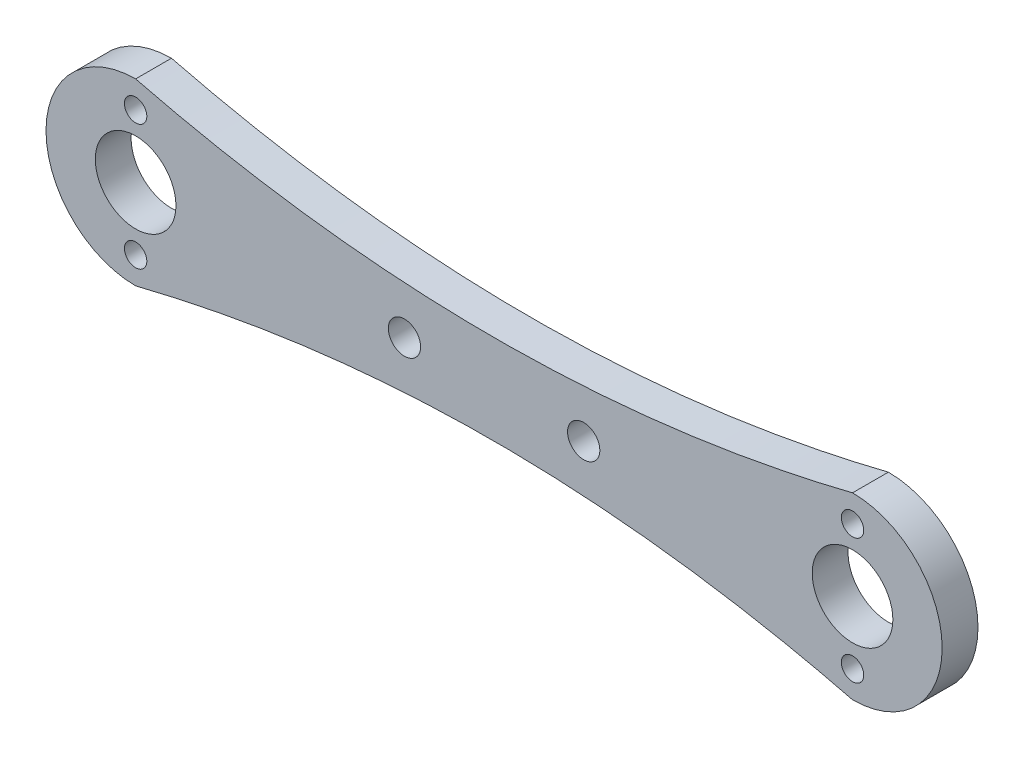
ISO-10303-21;
HEADER;
FILE_DESCRIPTION(('STEP AP214'),'2;1');
FILE_NAME('part.step','',(''),(''),'','','');
FILE_SCHEMA(('AUTOMOTIVE_DESIGN { 1 0 10303 214 1 1 1 1 }'));
ENDSEC;
DATA;
#1=APPLICATION_CONTEXT('core data for automotive mechanical design processes');
#2=APPLICATION_PROTOCOL_DEFINITION('international standard','automotive_design',2000,#1);
#3=PRODUCT_CONTEXT('',#1,'mechanical');
#4=PRODUCT('Part','Part','',(#3));
#5=PRODUCT_RELATED_PRODUCT_CATEGORY('part','',(#4));
#6=PRODUCT_DEFINITION_FORMATION('','',#4);
#7=PRODUCT_DEFINITION_CONTEXT('part definition',#1,'design');
#8=PRODUCT_DEFINITION('design','',#6,#7);
#9=PRODUCT_DEFINITION_SHAPE('','',#8);
#10=(LENGTH_UNIT() NAMED_UNIT(*) SI_UNIT(.MILLI.,.METRE.));
#11=(NAMED_UNIT(*) PLANE_ANGLE_UNIT() SI_UNIT($,.RADIAN.));
#12=(NAMED_UNIT(*) SI_UNIT($,.STERADIAN.) SOLID_ANGLE_UNIT());
#13=UNCERTAINTY_MEASURE_WITH_UNIT(LENGTH_MEASURE(1.E-05),#10,'distance_accuracy_value','');
#14=(GEOMETRIC_REPRESENTATION_CONTEXT(3) GLOBAL_UNCERTAINTY_ASSIGNED_CONTEXT((#13)) GLOBAL_UNIT_ASSIGNED_CONTEXT((#10,
#11,#12)) REPRESENTATION_CONTEXT('',''));
#15=CARTESIAN_POINT('',(0.,0.,0.));
#16=DIRECTION('',(0.,0.,1.));
#17=DIRECTION('',(1.,0.,0.));
#18=AXIS2_PLACEMENT_3D('',#15,#16,#17);
#19=CARTESIAN_POINT('',(0.,0.,4.));
#20=DIRECTION('',(0.,0.,-1.));
#21=DIRECTION('',(-1.,0.,0.));
#22=AXIS2_PLACEMENT_3D('',#19,#20,#21);
#23=CYLINDRICAL_SURFACE('',#22,10.0000002400058);
#24=CARTESIAN_POINT('',(0.,0.,0.));
#25=DIRECTION('',(0.,0.,1.));
#26=DIRECTION('',(1.,0.,0.));
#27=AXIS2_PLACEMENT_3D('',#24,#25,#26);
#28=CIRCLE('',#27,10.0000002400058);
#29=CARTESIAN_POINT('',(0.,10.0000002400058,0.));
#30=VERTEX_POINT('',#29);
#31=CARTESIAN_POINT('',(0.,-10.0000002400058,0.));
#32=VERTEX_POINT('',#31);
#33=EDGE_CURVE('E188',#30,#32,#28,.T.);
#34=ORIENTED_EDGE('',*,*,#33,.T.);
#35=DIRECTION('',(0.,0.,-1.));
#36=VECTOR('',#35,1.);
#37=CARTESIAN_POINT('',(0.,-10.0000002400058,4.));
#38=LINE('',#37,#36);
#39=CARTESIAN_POINT('',(0.,-10.0000002400058,4.));
#40=VERTEX_POINT('',#39);
#41=EDGE_CURVE('E11',#40,#32,#38,.T.);
#42=ORIENTED_EDGE('',*,*,#41,.F.);
#43=CARTESIAN_POINT('',(0.,0.,4.));
#44=DIRECTION('',(0.,0.,1.));
#45=DIRECTION('',(1.,0.,0.));
#46=AXIS2_PLACEMENT_3D('',#43,#44,#45);
#47=CIRCLE('',#46,10.0000002400058);
#48=CARTESIAN_POINT('',(0.,10.0000002400058,4.));
#49=VERTEX_POINT('',#48);
#50=EDGE_CURVE('E95',#49,#40,#47,.T.);
#51=ORIENTED_EDGE('',*,*,#50,.F.);
#52=DIRECTION('',(0.,0.,-1.));
#53=VECTOR('',#52,1.);
#54=CARTESIAN_POINT('',(0.,10.0000002400058,4.));
#55=LINE('',#54,#53);
#56=EDGE_CURVE('E62',#49,#30,#55,.T.);
#57=ORIENTED_EDGE('',*,*,#56,.T.);
#58=EDGE_LOOP('',(#34,#42,#51,#57));
#59=FACE_BOUND('',#58,.T.);
#60=ADVANCED_FACE('F44',(#59),#23,.T.);
#61=CARTESIAN_POINT('',(0.,-10.0000002400058,4.));
#62=CARTESIAN_POINT('',(40.,0.,4.));
#63=CARTESIAN_POINT('',(80.,-10.0000002400058,4.));
#64=B_SPLINE_CURVE_WITH_KNOTS('',2,(#61,#62,#63),.UNSPECIFIED.,.F.,.F.,(3,3),(0.,1.),.UNSPECIFIED.);
#65=DIRECTION('',(0.,0.,-1.));
#66=VECTOR('',#65,1.);
#67=SURFACE_OF_LINEAR_EXTRUSION('',#64,#66);
#68=CARTESIAN_POINT('',(0.,-10.0000002400058,0.));
#69=CARTESIAN_POINT('',(40.,0.,0.));
#70=CARTESIAN_POINT('',(80.,-10.0000002400058,0.));
#71=B_SPLINE_CURVE_WITH_KNOTS('',2,(#68,#69,#70),.UNSPECIFIED.,.F.,.F.,(3,3),(0.,1.),.UNSPECIFIED.);
#72=CARTESIAN_POINT('',(80.,-10.0000002400058,0.));
#73=VERTEX_POINT('',#72);
#74=EDGE_CURVE('E101',#32,#73,#71,.T.);
#75=ORIENTED_EDGE('',*,*,#74,.T.);
#76=DIRECTION('',(0.,0.,-1.));
#77=VECTOR('',#76,1.);
#78=CARTESIAN_POINT('',(80.,-10.0000002400058,4.));
#79=LINE('',#78,#77);
#80=CARTESIAN_POINT('',(80.,-10.0000002400058,4.));
#81=VERTEX_POINT('',#80);
#82=EDGE_CURVE('E54',#81,#73,#79,.T.);
#83=ORIENTED_EDGE('',*,*,#82,.F.);
#84=EDGE_CURVE('E88',#40,#81,#64,.T.);
#85=ORIENTED_EDGE('',*,*,#84,.F.);
#86=ORIENTED_EDGE('',*,*,#41,.T.);
#87=EDGE_LOOP('',(#75,#83,#85,#86));
#88=FACE_BOUND('',#87,.T.);
#89=ADVANCED_FACE('F100',(#88),#67,.F.);
#90=CARTESIAN_POINT('',(80.,0.,4.));
#91=DIRECTION('',(0.,0.,-1.));
#92=DIRECTION('',(-1.,0.,0.));
#93=AXIS2_PLACEMENT_3D('',#90,#91,#92);
#94=CYLINDRICAL_SURFACE('',#93,10.0000002400058);
#95=CARTESIAN_POINT('',(80.,0.,0.));
#96=DIRECTION('',(0.,0.,1.));
#97=DIRECTION('',(1.,0.,0.));
#98=AXIS2_PLACEMENT_3D('',#95,#96,#97);
#99=CIRCLE('',#98,10.0000002400058);
#100=CARTESIAN_POINT('',(80.,10.0000002400058,0.));
#101=VERTEX_POINT('',#100);
#102=EDGE_CURVE('E195',#73,#101,#99,.T.);
#103=ORIENTED_EDGE('',*,*,#102,.T.);
#104=DIRECTION('',(0.,0.,-1.));
#105=VECTOR('',#104,1.);
#106=CARTESIAN_POINT('',(80.,10.0000002400058,4.));
#107=LINE('',#106,#105);
#108=CARTESIAN_POINT('',(80.,10.0000002400058,4.));
#109=VERTEX_POINT('',#108);
#110=EDGE_CURVE('E77',#109,#101,#107,.T.);
#111=ORIENTED_EDGE('',*,*,#110,.F.);
#112=CARTESIAN_POINT('',(80.,0.,4.));
#113=DIRECTION('',(0.,0.,1.));
#114=DIRECTION('',(1.,0.,0.));
#115=AXIS2_PLACEMENT_3D('',#112,#113,#114);
#116=CIRCLE('',#115,10.0000002400058);
#117=EDGE_CURVE('E94',#81,#109,#116,.T.);
#118=ORIENTED_EDGE('',*,*,#117,.F.);
#119=ORIENTED_EDGE('',*,*,#82,.T.);
#120=EDGE_LOOP('',(#103,#111,#118,#119));
#121=FACE_BOUND('',#120,.T.);
#122=ADVANCED_FACE('F105',(#121),#94,.T.);
#123=CARTESIAN_POINT('',(0.,0.,4.));
#124=DIRECTION('',(0.,0.,-1.));
#125=DIRECTION('',(-1.,0.,0.));
#126=AXIS2_PLACEMENT_3D('',#123,#124,#125);
#127=CYLINDRICAL_SURFACE('',#126,4.5);
#128=CARTESIAN_POINT('',(0.,0.,4.));
#129=DIRECTION('',(0.,0.,1.));
#130=DIRECTION('',(1.,0.,0.));
#131=AXIS2_PLACEMENT_3D('',#128,#129,#130);
#132=CIRCLE('',#131,4.5);
#133=CARTESIAN_POINT('',(4.5,0.,4.));
#134=VERTEX_POINT('',#133);
#135=EDGE_CURVE('E236',#134,#134,#132,.T.);
#136=ORIENTED_EDGE('',*,*,#135,.T.);
#137=EDGE_LOOP('',(#136));
#138=FACE_BOUND('',#137,.T.);
#139=CARTESIAN_POINT('',(0.,0.,0.));
#140=DIRECTION('',(0.,0.,1.));
#141=DIRECTION('',(1.,0.,0.));
#142=AXIS2_PLACEMENT_3D('',#139,#140,#141);
#143=CIRCLE('',#142,4.5);
#144=CARTESIAN_POINT('',(4.5,0.,0.));
#145=VERTEX_POINT('',#144);
#146=EDGE_CURVE('E184',#145,#145,#143,.T.);
#147=ORIENTED_EDGE('',*,*,#146,.F.);
#148=EDGE_LOOP('',(#147));
#149=FACE_BOUND('',#148,.T.);
#150=ADVANCED_FACE('F133',(#138,#149),#127,.F.);
#151=CARTESIAN_POINT('',(80.,0.,4.));
#152=DIRECTION('',(0.,0.,-1.));
#153=DIRECTION('',(-1.,0.,0.));
#154=AXIS2_PLACEMENT_3D('',#151,#152,#153);
#155=CYLINDRICAL_SURFACE('',#154,4.5);
#156=CARTESIAN_POINT('',(80.,0.,4.));
#157=DIRECTION('',(0.,0.,1.));
#158=DIRECTION('',(1.,0.,0.));
#159=AXIS2_PLACEMENT_3D('',#156,#157,#158);
#160=CIRCLE('',#159,4.5);
#161=CARTESIAN_POINT('',(84.5,0.,4.));
#162=VERTEX_POINT('',#161);
#163=EDGE_CURVE('E232',#162,#162,#160,.T.);
#164=ORIENTED_EDGE('',*,*,#163,.T.);
#165=EDGE_LOOP('',(#164));
#166=FACE_BOUND('',#165,.T.);
#167=CARTESIAN_POINT('',(80.,0.,0.));
#168=DIRECTION('',(0.,0.,1.));
#169=DIRECTION('',(1.,0.,0.));
#170=AXIS2_PLACEMENT_3D('',#167,#168,#169);
#171=CIRCLE('',#170,4.5);
#172=CARTESIAN_POINT('',(84.5,0.,0.));
#173=VERTEX_POINT('',#172);
#174=EDGE_CURVE('E180',#173,#173,#171,.T.);
#175=ORIENTED_EDGE('',*,*,#174,.F.);
#176=EDGE_LOOP('',(#175));
#177=FACE_BOUND('',#176,.T.);
#178=ADVANCED_FACE('F140',(#166,#177),#155,.F.);
#179=CARTESIAN_POINT('',(0.,7.,4.));
#180=DIRECTION('',(0.,0.,-1.));
#181=DIRECTION('',(-1.,0.,0.));
#182=AXIS2_PLACEMENT_3D('',#179,#180,#181);
#183=CYLINDRICAL_SURFACE('',#182,1.25);
#184=CARTESIAN_POINT('',(0.,7.,4.));
#185=DIRECTION('',(0.,0.,1.));
#186=DIRECTION('',(1.,0.,0.));
#187=AXIS2_PLACEMENT_3D('',#184,#185,#186);
#188=CIRCLE('',#187,1.25);
#189=CARTESIAN_POINT('',(1.25,7.,4.));
#190=VERTEX_POINT('',#189);
#191=EDGE_CURVE('E228',#190,#190,#188,.T.);
#192=ORIENTED_EDGE('',*,*,#191,.T.);
#193=EDGE_LOOP('',(#192));
#194=FACE_BOUND('',#193,.T.);
#195=CARTESIAN_POINT('',(0.,7.,0.));
#196=DIRECTION('',(0.,0.,1.));
#197=DIRECTION('',(1.,0.,0.));
#198=AXIS2_PLACEMENT_3D('',#195,#196,#197);
#199=CIRCLE('',#198,1.25);
#200=CARTESIAN_POINT('',(1.25,7.,0.));
#201=VERTEX_POINT('',#200);
#202=EDGE_CURVE('E172',#201,#201,#199,.T.);
#203=ORIENTED_EDGE('',*,*,#202,.F.);
#204=EDGE_LOOP('',(#203));
#205=FACE_BOUND('',#204,.T.);
#206=ADVANCED_FACE('F144',(#194,#205),#183,.F.);
#207=CARTESIAN_POINT('',(0.,-7.,4.));
#208=DIRECTION('',(0.,0.,-1.));
#209=DIRECTION('',(-1.,0.,0.));
#210=AXIS2_PLACEMENT_3D('',#207,#208,#209);
#211=CYLINDRICAL_SURFACE('',#210,1.25);
#212=CARTESIAN_POINT('',(0.,-7.,4.));
#213=DIRECTION('',(0.,0.,1.));
#214=DIRECTION('',(1.,0.,0.));
#215=AXIS2_PLACEMENT_3D('',#212,#213,#214);
#216=CIRCLE('',#215,1.25);
#217=CARTESIAN_POINT('',(1.25,-7.,4.));
#218=VERTEX_POINT('',#217);
#219=EDGE_CURVE('E220',#218,#218,#216,.T.);
#220=ORIENTED_EDGE('',*,*,#219,.T.);
#221=EDGE_LOOP('',(#220));
#222=FACE_BOUND('',#221,.T.);
#223=CARTESIAN_POINT('',(0.,-7.,0.));
#224=DIRECTION('',(0.,0.,1.));
#225=DIRECTION('',(1.,0.,0.));
#226=AXIS2_PLACEMENT_3D('',#223,#224,#225);
#227=CIRCLE('',#226,1.25);
#228=CARTESIAN_POINT('',(1.25,-7.,0.));
#229=VERTEX_POINT('',#228);
#230=EDGE_CURVE('E168',#229,#229,#227,.T.);
#231=ORIENTED_EDGE('',*,*,#230,.F.);
#232=EDGE_LOOP('',(#231));
#233=FACE_BOUND('',#232,.T.);
#234=ADVANCED_FACE('F148',(#222,#233),#211,.F.);
#235=CARTESIAN_POINT('',(80.,7.,4.));
#236=DIRECTION('',(0.,0.,-1.));
#237=DIRECTION('',(-1.,0.,0.));
#238=AXIS2_PLACEMENT_3D('',#235,#236,#237);
#239=CYLINDRICAL_SURFACE('',#238,1.25);
#240=CARTESIAN_POINT('',(80.,7.,4.));
#241=DIRECTION('',(0.,0.,1.));
#242=DIRECTION('',(1.,0.,0.));
#243=AXIS2_PLACEMENT_3D('',#240,#241,#242);
#244=CIRCLE('',#243,1.25);
#245=CARTESIAN_POINT('',(81.25,7.,4.));
#246=VERTEX_POINT('',#245);
#247=EDGE_CURVE('E162',#246,#246,#244,.T.);
#248=ORIENTED_EDGE('',*,*,#247,.T.);
#249=EDGE_LOOP('',(#248));
#250=FACE_BOUND('',#249,.T.);
#251=CARTESIAN_POINT('',(80.,7.,0.));
#252=DIRECTION('',(0.,0.,1.));
#253=DIRECTION('',(1.,0.,0.));
#254=AXIS2_PLACEMENT_3D('',#251,#252,#253);
#255=CIRCLE('',#254,1.25);
#256=CARTESIAN_POINT('',(81.25,7.,0.));
#257=VERTEX_POINT('',#256);
#258=EDGE_CURVE('E165',#257,#257,#255,.T.);
#259=ORIENTED_EDGE('',*,*,#258,.F.);
#260=EDGE_LOOP('',(#259));
#261=FACE_BOUND('',#260,.T.);
#262=ADVANCED_FACE('F151',(#250,#261),#239,.F.);
#263=CARTESIAN_POINT('',(80.,-7.,4.));
#264=DIRECTION('',(0.,0.,-1.));
#265=DIRECTION('',(-1.,0.,0.));
#266=AXIS2_PLACEMENT_3D('',#263,#264,#265);
#267=CYLINDRICAL_SURFACE('',#266,1.25);
#268=CARTESIAN_POINT('',(80.,-7.,4.));
#269=DIRECTION('',(0.,0.,1.));
#270=DIRECTION('',(1.,0.,0.));
#271=AXIS2_PLACEMENT_3D('',#268,#269,#270);
#272=CIRCLE('',#271,1.25);
#273=CARTESIAN_POINT('',(81.25,-7.,4.));
#274=VERTEX_POINT('',#273);
#275=EDGE_CURVE('E207',#274,#274,#272,.T.);
#276=ORIENTED_EDGE('',*,*,#275,.T.);
#277=EDGE_LOOP('',(#276));
#278=FACE_BOUND('',#277,.T.);
#279=CARTESIAN_POINT('',(80.,-7.,0.));
#280=DIRECTION('',(0.,0.,1.));
#281=DIRECTION('',(1.,0.,0.));
#282=AXIS2_PLACEMENT_3D('',#279,#280,#281);
#283=CIRCLE('',#282,1.25);
#284=CARTESIAN_POINT('',(81.25,-7.,0.));
#285=VERTEX_POINT('',#284);
#286=EDGE_CURVE('E119',#285,#285,#283,.T.);
#287=ORIENTED_EDGE('',*,*,#286,.F.);
#288=EDGE_LOOP('',(#287));
#289=FACE_BOUND('',#288,.T.);
#290=ADVANCED_FACE('F46',(#278,#289),#267,.F.);
#291=CARTESIAN_POINT('',(0.,10.0000002400058,4.));
#292=CARTESIAN_POINT('',(40.,0.,4.));
#293=CARTESIAN_POINT('',(80.,10.0000002400058,4.));
#294=B_SPLINE_CURVE_WITH_KNOTS('',2,(#291,#292,#293),.UNSPECIFIED.,.F.,.F.,(3,3),(0.,1.),.UNSPECIFIED.);
#295=DIRECTION('',(0.,0.,-1.));
#296=VECTOR('',#295,1.);
#297=SURFACE_OF_LINEAR_EXTRUSION('',#294,#296);
#298=CARTESIAN_POINT('',(0.,10.0000002400058,0.));
#299=CARTESIAN_POINT('',(40.,0.,0.));
#300=CARTESIAN_POINT('',(80.,10.0000002400058,0.));
#301=B_SPLINE_CURVE_WITH_KNOTS('',2,(#298,#299,#300),.UNSPECIFIED.,.F.,.F.,(3,3),(0.,1.),.UNSPECIFIED.);
#302=EDGE_CURVE('E201',#30,#101,#301,.T.);
#303=ORIENTED_EDGE('',*,*,#302,.F.);
#304=ORIENTED_EDGE('',*,*,#56,.F.);
#305=EDGE_CURVE('E107',#49,#109,#294,.T.);
#306=ORIENTED_EDGE('',*,*,#305,.T.);
#307=ORIENTED_EDGE('',*,*,#110,.T.);
#308=EDGE_LOOP('',(#303,#304,#306,#307));
#309=FACE_BOUND('',#308,.T.);
#310=ADVANCED_FACE('F125',(#309),#297,.T.);
#311=CARTESIAN_POINT('',(0.,0.,4.));
#312=DIRECTION('',(0.,0.,1.));
#313=DIRECTION('',(1.,0.,0.));
#314=AXIS2_PLACEMENT_3D('',#311,#312,#313);
#315=PLANE('',#314);
#316=CARTESIAN_POINT('',(50.,0.,4.));
#317=DIRECTION('',(0.,0.,1.));
#318=DIRECTION('',(1.,0.,0.));
#319=AXIS2_PLACEMENT_3D('',#316,#317,#318);
#320=CIRCLE('',#319,1.8);
#321=CARTESIAN_POINT('',(51.8,0.,4.));
#322=VERTEX_POINT('',#321);
#323=EDGE_CURVE('E175',#322,#322,#320,.T.);
#324=ORIENTED_EDGE('',*,*,#323,.F.);
#325=EDGE_LOOP('',(#324));
#326=FACE_BOUND('',#325,.T.);
#327=CARTESIAN_POINT('',(30.,0.,4.));
#328=DIRECTION('',(0.,0.,1.));
#329=DIRECTION('',(1.,0.,0.));
#330=AXIS2_PLACEMENT_3D('',#327,#328,#329);
#331=CIRCLE('',#330,1.8);
#332=CARTESIAN_POINT('',(31.8,0.,4.));
#333=VERTEX_POINT('',#332);
#334=EDGE_CURVE('E268',#333,#333,#331,.T.);
#335=ORIENTED_EDGE('',*,*,#334,.F.);
#336=EDGE_LOOP('',(#335));
#337=FACE_BOUND('',#336,.T.);
#338=ORIENTED_EDGE('',*,*,#275,.F.);
#339=EDGE_LOOP('',(#338));
#340=FACE_BOUND('',#339,.T.);
#341=ORIENTED_EDGE('',*,*,#247,.F.);
#342=EDGE_LOOP('',(#341));
#343=FACE_BOUND('',#342,.T.);
#344=ORIENTED_EDGE('',*,*,#219,.F.);
#345=EDGE_LOOP('',(#344));
#346=FACE_BOUND('',#345,.T.);
#347=ORIENTED_EDGE('',*,*,#191,.F.);
#348=EDGE_LOOP('',(#347));
#349=FACE_BOUND('',#348,.T.);
#350=ORIENTED_EDGE('',*,*,#163,.F.);
#351=EDGE_LOOP('',(#350));
#352=FACE_BOUND('',#351,.T.);
#353=ORIENTED_EDGE('',*,*,#135,.F.);
#354=EDGE_LOOP('',(#353));
#355=FACE_BOUND('',#354,.T.);
#356=ORIENTED_EDGE('',*,*,#50,.T.);
#357=ORIENTED_EDGE('',*,*,#84,.T.);
#358=ORIENTED_EDGE('',*,*,#117,.T.);
#359=ORIENTED_EDGE('',*,*,#305,.F.);
#360=EDGE_LOOP('',(#356,#357,#358,#359));
#361=FACE_BOUND('',#360,.T.);
#362=ADVANCED_FACE('F91',(#326,#337,#340,#343,#346,#349,#352,#355,#361),#315,.T.);
#363=CARTESIAN_POINT('',(0.,0.,0.));
#364=DIRECTION('',(0.,0.,1.));
#365=DIRECTION('',(1.,0.,0.));
#366=AXIS2_PLACEMENT_3D('',#363,#364,#365);
#367=PLANE('',#366);
#368=CARTESIAN_POINT('',(50.,0.,0.));
#369=DIRECTION('',(0.,0.,-1.));
#370=DIRECTION('',(-1.,0.,0.));
#371=AXIS2_PLACEMENT_3D('',#368,#369,#370);
#372=CIRCLE('',#371,1.8);
#373=CARTESIAN_POINT('',(48.2,0.,0.));
#374=VERTEX_POINT('',#373);
#375=EDGE_CURVE('E266',#374,#374,#372,.T.);
#376=ORIENTED_EDGE('',*,*,#375,.F.);
#377=EDGE_LOOP('',(#376));
#378=FACE_BOUND('',#377,.T.);
#379=CARTESIAN_POINT('',(30.,0.,0.));
#380=DIRECTION('',(0.,0.,-1.));
#381=DIRECTION('',(-1.,0.,0.));
#382=AXIS2_PLACEMENT_3D('',#379,#380,#381);
#383=CIRCLE('',#382,1.8);
#384=CARTESIAN_POINT('',(28.2,0.,0.));
#385=VERTEX_POINT('',#384);
#386=EDGE_CURVE('E269',#385,#385,#383,.T.);
#387=ORIENTED_EDGE('',*,*,#386,.F.);
#388=EDGE_LOOP('',(#387));
#389=FACE_BOUND('',#388,.T.);
#390=ORIENTED_EDGE('',*,*,#286,.T.);
#391=EDGE_LOOP('',(#390));
#392=FACE_BOUND('',#391,.T.);
#393=ORIENTED_EDGE('',*,*,#258,.T.);
#394=EDGE_LOOP('',(#393));
#395=FACE_BOUND('',#394,.T.);
#396=ORIENTED_EDGE('',*,*,#230,.T.);
#397=EDGE_LOOP('',(#396));
#398=FACE_BOUND('',#397,.T.);
#399=ORIENTED_EDGE('',*,*,#202,.T.);
#400=EDGE_LOOP('',(#399));
#401=FACE_BOUND('',#400,.T.);
#402=ORIENTED_EDGE('',*,*,#174,.T.);
#403=EDGE_LOOP('',(#402));
#404=FACE_BOUND('',#403,.T.);
#405=ORIENTED_EDGE('',*,*,#146,.T.);
#406=EDGE_LOOP('',(#405));
#407=FACE_BOUND('',#406,.T.);
#408=ORIENTED_EDGE('',*,*,#33,.F.);
#409=ORIENTED_EDGE('',*,*,#302,.T.);
#410=ORIENTED_EDGE('',*,*,#102,.F.);
#411=ORIENTED_EDGE('',*,*,#74,.F.);
#412=EDGE_LOOP('',(#408,#409,#410,#411));
#413=FACE_BOUND('',#412,.T.);
#414=ADVANCED_FACE('F129',(#378,#389,#392,#395,#398,#401,#404,#407,#413),#367,.F.);
#415=CARTESIAN_POINT('',(30.,0.,10.));
#416=DIRECTION('',(0.,0.,-1.));
#417=DIRECTION('',(-1.,0.,0.));
#418=AXIS2_PLACEMENT_3D('',#415,#416,#417);
#419=CYLINDRICAL_SURFACE('',#418,1.8);
#420=ORIENTED_EDGE('',*,*,#334,.T.);
#421=EDGE_LOOP('',(#420));
#422=FACE_BOUND('',#421,.T.);
#423=ORIENTED_EDGE('',*,*,#386,.T.);
#424=EDGE_LOOP('',(#423));
#425=FACE_BOUND('',#424,.T.);
#426=ADVANCED_FACE('F249',(#422,#425),#419,.F.);
#427=CARTESIAN_POINT('',(50.,0.,10.));
#428=DIRECTION('',(0.,0.,-1.));
#429=DIRECTION('',(-1.,0.,0.));
#430=AXIS2_PLACEMENT_3D('',#427,#428,#429);
#431=CYLINDRICAL_SURFACE('',#430,1.8);
#432=ORIENTED_EDGE('',*,*,#323,.T.);
#433=EDGE_LOOP('',(#432));
#434=FACE_BOUND('',#433,.T.);
#435=ORIENTED_EDGE('',*,*,#375,.T.);
#436=EDGE_LOOP('',(#435));
#437=FACE_BOUND('',#436,.T.);
#438=ADVANCED_FACE('F256',(#434,#437),#431,.F.);
#439=CLOSED_SHELL('',(#60,#89,#122,#150,#178,#206,#234,#262,#290,#310,#362,#414,#426,#438));
#440=MANIFOLD_SOLID_BREP('B2',#439);
#441=ADVANCED_BREP_SHAPE_REPRESENTATION('',(#18,#440),#14);
#442=SHAPE_DEFINITION_REPRESENTATION(#9,#441);
ENDSEC;
END-ISO-10303-21;
